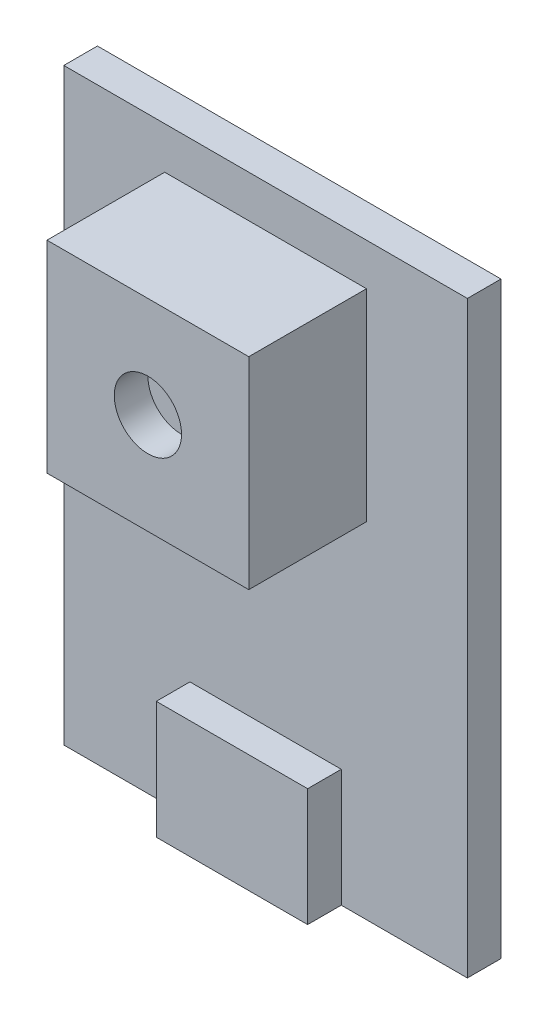
ISO-10303-21;
HEADER;
FILE_DESCRIPTION(('STEP AP214'),'2;1');
FILE_NAME('part.step','',(''),(''),'','','');
FILE_SCHEMA(('AUTOMOTIVE_DESIGN { 1 0 10303 214 1 1 1 1 }'));
ENDSEC;
DATA;
#1=APPLICATION_CONTEXT('core data for automotive mechanical design processes');
#2=APPLICATION_PROTOCOL_DEFINITION('international standard','automotive_design',2000,#1);
#3=PRODUCT_CONTEXT('',#1,'mechanical');
#4=PRODUCT('Part','Part','',(#3));
#5=PRODUCT_RELATED_PRODUCT_CATEGORY('part','',(#4));
#6=PRODUCT_DEFINITION_FORMATION('','',#4);
#7=PRODUCT_DEFINITION_CONTEXT('part definition',#1,'design');
#8=PRODUCT_DEFINITION('design','',#6,#7);
#9=PRODUCT_DEFINITION_SHAPE('','',#8);
#10=(LENGTH_UNIT() NAMED_UNIT(*) SI_UNIT(.MILLI.,.METRE.));
#11=(NAMED_UNIT(*) PLANE_ANGLE_UNIT() SI_UNIT($,.RADIAN.));
#12=(NAMED_UNIT(*) SI_UNIT($,.STERADIAN.) SOLID_ANGLE_UNIT());
#13=UNCERTAINTY_MEASURE_WITH_UNIT(LENGTH_MEASURE(1.E-05),#10,'distance_accuracy_value','');
#14=(GEOMETRIC_REPRESENTATION_CONTEXT(3) GLOBAL_UNCERTAINTY_ASSIGNED_CONTEXT((#13)) GLOBAL_UNIT_ASSIGNED_CONTEXT((#10,
#11,#12)) REPRESENTATION_CONTEXT('',''));
#15=CARTESIAN_POINT('',(0.,0.,0.));
#16=DIRECTION('',(0.,0.,1.));
#17=DIRECTION('',(1.,0.,0.));
#18=AXIS2_PLACEMENT_3D('',#15,#16,#17);
#19=CARTESIAN_POINT('',(0.,0.,0.));
#20=DIRECTION('',(0.,0.,1.));
#21=DIRECTION('',(1.,0.,0.));
#22=AXIS2_PLACEMENT_3D('',#19,#20,#21);
#23=PLANE('',#22);
#24=DIRECTION('',(0.,1.,0.));
#25=VECTOR('',#24,1.);
#26=CARTESIAN_POINT('',(6.,6.,0.));
#27=LINE('',#26,#25);
#28=CARTESIAN_POINT('',(6.,-6.,0.));
#29=VERTEX_POINT('',#28);
#30=CARTESIAN_POINT('',(6.,6.,0.));
#31=VERTEX_POINT('',#30);
#32=EDGE_CURVE('E81',#29,#31,#27,.T.);
#33=ORIENTED_EDGE('',*,*,#32,.F.);
#34=DIRECTION('',(1.,0.,0.));
#35=VECTOR('',#34,1.);
#36=CARTESIAN_POINT('',(-6.,-6.,0.));
#37=LINE('',#36,#35);
#38=CARTESIAN_POINT('',(-6.,-6.,0.));
#39=VERTEX_POINT('',#38);
#40=EDGE_CURVE('E114',#39,#29,#37,.T.);
#41=ORIENTED_EDGE('',*,*,#40,.F.);
#42=DIRECTION('',(0.,-1.,0.));
#43=VECTOR('',#42,1.);
#44=CARTESIAN_POINT('',(-6.,6.,0.));
#45=LINE('',#44,#43);
#46=CARTESIAN_POINT('',(-6.,6.,0.));
#47=VERTEX_POINT('',#46);
#48=EDGE_CURVE('E73',#47,#39,#45,.T.);
#49=ORIENTED_EDGE('',*,*,#48,.F.);
#50=DIRECTION('',(-1.,0.,0.));
#51=VECTOR('',#50,1.);
#52=CARTESIAN_POINT('',(-6.,6.,0.));
#53=LINE('',#52,#51);
#54=EDGE_CURVE('E100',#31,#47,#53,.T.);
#55=ORIENTED_EDGE('',*,*,#54,.F.);
#56=EDGE_LOOP('',(#33,#41,#49,#55));
#57=FACE_BOUND('',#56,.T.);
#58=DIRECTION('',(-1.,0.,0.));
#59=VECTOR('',#58,1.);
#60=CARTESIAN_POINT('',(12.,-26.5,0.));
#61=LINE('',#60,#59);
#62=CARTESIAN_POINT('',(-4.5,-26.5,0.));
#63=VERTEX_POINT('',#62);
#64=CARTESIAN_POINT('',(-12.,-26.5,0.));
#65=VERTEX_POINT('',#64);
#66=EDGE_CURVE('E138',#63,#65,#61,.T.);
#67=ORIENTED_EDGE('',*,*,#66,.F.);
#68=DIRECTION('',(0.,-1.,0.));
#69=VECTOR('',#68,1.);
#70=CARTESIAN_POINT('',(-4.5,-26.5,0.));
#71=LINE('',#70,#69);
#72=CARTESIAN_POINT('',(-4.5,-19.5,0.));
#73=VERTEX_POINT('',#72);
#74=EDGE_CURVE('E51',#73,#63,#71,.T.);
#75=ORIENTED_EDGE('',*,*,#74,.F.);
#76=DIRECTION('',(-1.,0.,0.));
#77=VECTOR('',#76,1.);
#78=CARTESIAN_POINT('',(-4.5,-19.5,0.));
#79=LINE('',#78,#77);
#80=CARTESIAN_POINT('',(4.5,-19.5,0.));
#81=VERTEX_POINT('',#80);
#82=EDGE_CURVE('E169',#81,#73,#79,.T.);
#83=ORIENTED_EDGE('',*,*,#82,.F.);
#84=DIRECTION('',(0.,1.,0.));
#85=VECTOR('',#84,1.);
#86=CARTESIAN_POINT('',(4.5,-26.5,0.));
#87=LINE('',#86,#85);
#88=CARTESIAN_POINT('',(4.5,-26.5,0.));
#89=VERTEX_POINT('',#88);
#90=EDGE_CURVE('E173',#89,#81,#87,.T.);
#91=ORIENTED_EDGE('',*,*,#90,.F.);
#92=CARTESIAN_POINT('',(12.,-26.5,0.));
#93=VERTEX_POINT('',#92);
#94=EDGE_CURVE('E134',#93,#89,#61,.T.);
#95=ORIENTED_EDGE('',*,*,#94,.F.);
#96=DIRECTION('',(0.,-1.,0.));
#97=VECTOR('',#96,1.);
#98=CARTESIAN_POINT('',(12.,-26.5,0.));
#99=LINE('',#98,#97);
#100=CARTESIAN_POINT('',(12.,8.50000000000001,0.));
#101=VERTEX_POINT('',#100);
#102=EDGE_CURVE('E139',#101,#93,#99,.T.);
#103=ORIENTED_EDGE('',*,*,#102,.F.);
#104=DIRECTION('',(1.,0.,0.));
#105=VECTOR('',#104,1.);
#106=CARTESIAN_POINT('',(12.,8.50000000000001,0.));
#107=LINE('',#106,#105);
#108=CARTESIAN_POINT('',(-12.,8.50000000000001,0.));
#109=VERTEX_POINT('',#108);
#110=EDGE_CURVE('E142',#109,#101,#107,.T.);
#111=ORIENTED_EDGE('',*,*,#110,.F.);
#112=DIRECTION('',(0.,1.,0.));
#113=VECTOR('',#112,1.);
#114=CARTESIAN_POINT('',(-12.,-26.5,0.));
#115=LINE('',#114,#113);
#116=EDGE_CURVE('E145',#65,#109,#115,.T.);
#117=ORIENTED_EDGE('',*,*,#116,.F.);
#118=EDGE_LOOP('',(#67,#75,#83,#91,#95,#103,#111,#117));
#119=FACE_BOUND('',#118,.T.);
#120=ADVANCED_FACE('F36',(#57,#119),#23,.T.);
#121=CARTESIAN_POINT('',(6.,6.,7.));
#122=DIRECTION('',(-1.,0.,0.));
#123=DIRECTION('',(0.,-1.,0.));
#124=AXIS2_PLACEMENT_3D('',#121,#122,#123);
#125=PLANE('',#124);
#126=ORIENTED_EDGE('',*,*,#32,.T.);
#127=DIRECTION('',(0.,0.,-1.));
#128=VECTOR('',#127,1.);
#129=CARTESIAN_POINT('',(6.,6.,7.));
#130=LINE('',#129,#128);
#131=CARTESIAN_POINT('',(6.,6.,7.));
#132=VERTEX_POINT('',#131);
#133=EDGE_CURVE('E11',#132,#31,#130,.T.);
#134=ORIENTED_EDGE('',*,*,#133,.F.);
#135=DIRECTION('',(0.,1.,0.));
#136=VECTOR('',#135,1.);
#137=CARTESIAN_POINT('',(6.,6.,7.));
#138=LINE('',#137,#136);
#139=CARTESIAN_POINT('',(6.,-6.,7.));
#140=VERTEX_POINT('',#139);
#141=EDGE_CURVE('E94',#140,#132,#138,.T.);
#142=ORIENTED_EDGE('',*,*,#141,.F.);
#143=DIRECTION('',(0.,0.,-1.));
#144=VECTOR('',#143,1.);
#145=CARTESIAN_POINT('',(6.,-6.,7.));
#146=LINE('',#145,#144);
#147=EDGE_CURVE('E106',#140,#29,#146,.T.);
#148=ORIENTED_EDGE('',*,*,#147,.T.);
#149=EDGE_LOOP('',(#126,#134,#142,#148));
#150=FACE_BOUND('',#149,.T.);
#151=ADVANCED_FACE('F38',(#150),#125,.F.);
#152=CARTESIAN_POINT('',(-6.,6.,7.));
#153=DIRECTION('',(0.,-1.,0.));
#154=DIRECTION('',(0.,0.,-1.));
#155=AXIS2_PLACEMENT_3D('',#152,#153,#154);
#156=PLANE('',#155);
#157=ORIENTED_EDGE('',*,*,#54,.T.);
#158=DIRECTION('',(0.,0.,-1.));
#159=VECTOR('',#158,1.);
#160=CARTESIAN_POINT('',(-6.,6.,7.));
#161=LINE('',#160,#159);
#162=CARTESIAN_POINT('',(-6.,6.,7.));
#163=VERTEX_POINT('',#162);
#164=EDGE_CURVE('E44',#163,#47,#161,.T.);
#165=ORIENTED_EDGE('',*,*,#164,.F.);
#166=DIRECTION('',(-1.,0.,0.));
#167=VECTOR('',#166,1.);
#168=CARTESIAN_POINT('',(-6.,6.,7.));
#169=LINE('',#168,#167);
#170=EDGE_CURVE('E87',#132,#163,#169,.T.);
#171=ORIENTED_EDGE('',*,*,#170,.F.);
#172=ORIENTED_EDGE('',*,*,#133,.T.);
#173=EDGE_LOOP('',(#157,#165,#171,#172));
#174=FACE_BOUND('',#173,.T.);
#175=ADVANCED_FACE('F99',(#174),#156,.F.);
#176=CARTESIAN_POINT('',(-6.,6.,7.));
#177=DIRECTION('',(1.,0.,0.));
#178=DIRECTION('',(0.,0.,-1.));
#179=AXIS2_PLACEMENT_3D('',#176,#177,#178);
#180=PLANE('',#179);
#181=ORIENTED_EDGE('',*,*,#48,.T.);
#182=DIRECTION('',(0.,0.,-1.));
#183=VECTOR('',#182,1.);
#184=CARTESIAN_POINT('',(-6.,-6.,7.));
#185=LINE('',#184,#183);
#186=CARTESIAN_POINT('',(-6.,-6.,7.));
#187=VERTEX_POINT('',#186);
#188=EDGE_CURVE('E102',#187,#39,#185,.T.);
#189=ORIENTED_EDGE('',*,*,#188,.F.);
#190=DIRECTION('',(0.,-1.,0.));
#191=VECTOR('',#190,1.);
#192=CARTESIAN_POINT('',(-6.,6.,7.));
#193=LINE('',#192,#191);
#194=EDGE_CURVE('E91',#163,#187,#193,.T.);
#195=ORIENTED_EDGE('',*,*,#194,.F.);
#196=ORIENTED_EDGE('',*,*,#164,.T.);
#197=EDGE_LOOP('',(#181,#189,#195,#196));
#198=FACE_BOUND('',#197,.T.);
#199=ADVANCED_FACE('F103',(#198),#180,.F.);
#200=CARTESIAN_POINT('',(-6.,-6.,7.));
#201=DIRECTION('',(0.,1.,0.));
#202=DIRECTION('',(0.,0.,1.));
#203=AXIS2_PLACEMENT_3D('',#200,#201,#202);
#204=PLANE('',#203);
#205=ORIENTED_EDGE('',*,*,#40,.T.);
#206=ORIENTED_EDGE('',*,*,#147,.F.);
#207=DIRECTION('',(1.,0.,0.));
#208=VECTOR('',#207,1.);
#209=CARTESIAN_POINT('',(-6.,-6.,7.));
#210=LINE('',#209,#208);
#211=EDGE_CURVE('E60',#187,#140,#210,.T.);
#212=ORIENTED_EDGE('',*,*,#211,.F.);
#213=ORIENTED_EDGE('',*,*,#188,.T.);
#214=EDGE_LOOP('',(#205,#206,#212,#213));
#215=FACE_BOUND('',#214,.T.);
#216=ADVANCED_FACE('F119',(#215),#204,.F.);
#217=CARTESIAN_POINT('',(0.,0.,7.));
#218=DIRECTION('',(0.,0.,1.));
#219=DIRECTION('',(1.,0.,0.));
#220=AXIS2_PLACEMENT_3D('',#217,#218,#219);
#221=PLANE('',#220);
#222=CARTESIAN_POINT('',(0.,0.,7.));
#223=DIRECTION('',(0.,0.,1.));
#224=DIRECTION('',(1.,0.,0.));
#225=AXIS2_PLACEMENT_3D('',#222,#223,#224);
#226=CIRCLE('',#225,2.);
#227=CARTESIAN_POINT('',(2.,0.,7.));
#228=VERTEX_POINT('',#227);
#229=EDGE_CURVE('E188',#228,#228,#226,.T.);
#230=ORIENTED_EDGE('',*,*,#229,.F.);
#231=EDGE_LOOP('',(#230));
#232=FACE_BOUND('',#231,.T.);
#233=ORIENTED_EDGE('',*,*,#141,.T.);
#234=ORIENTED_EDGE('',*,*,#170,.T.);
#235=ORIENTED_EDGE('',*,*,#194,.T.);
#236=ORIENTED_EDGE('',*,*,#211,.T.);
#237=EDGE_LOOP('',(#233,#234,#235,#236));
#238=FACE_BOUND('',#237,.T.);
#239=ADVANCED_FACE('F89',(#232,#238),#221,.T.);
#240=CARTESIAN_POINT('',(-12.,-26.5,-2.));
#241=DIRECTION('',(1.,0.,0.));
#242=DIRECTION('',(0.,0.,-1.));
#243=AXIS2_PLACEMENT_3D('',#240,#241,#242);
#244=PLANE('',#243);
#245=ORIENTED_EDGE('',*,*,#116,.T.);
#246=DIRECTION('',(0.,0.,1.));
#247=VECTOR('',#246,1.);
#248=CARTESIAN_POINT('',(-12.,8.50000000000001,-2.));
#249=LINE('',#248,#247);
#250=CARTESIAN_POINT('',(-12.,8.50000000000001,-2.));
#251=VERTEX_POINT('',#250);
#252=EDGE_CURVE('E111',#251,#109,#249,.T.);
#253=ORIENTED_EDGE('',*,*,#252,.F.);
#254=DIRECTION('',(0.,1.,0.));
#255=VECTOR('',#254,1.);
#256=CARTESIAN_POINT('',(-12.,-26.5,-2.));
#257=LINE('',#256,#255);
#258=CARTESIAN_POINT('',(-12.,-26.5,-2.));
#259=VERTEX_POINT('',#258);
#260=EDGE_CURVE('E137',#259,#251,#257,.T.);
#261=ORIENTED_EDGE('',*,*,#260,.F.);
#262=DIRECTION('',(0.,0.,1.));
#263=VECTOR('',#262,1.);
#264=CARTESIAN_POINT('',(-12.,-26.5,-2.));
#265=LINE('',#264,#263);
#266=EDGE_CURVE('E130',#259,#65,#265,.T.);
#267=ORIENTED_EDGE('',*,*,#266,.T.);
#268=EDGE_LOOP('',(#245,#253,#261,#267));
#269=FACE_BOUND('',#268,.T.);
#270=ADVANCED_FACE('F204',(#269),#244,.F.);
#271=CARTESIAN_POINT('',(12.,8.50000000000001,-2.));
#272=DIRECTION('',(0.,-1.,0.));
#273=DIRECTION('',(1.,0.,0.));
#274=AXIS2_PLACEMENT_3D('',#271,#272,#273);
#275=PLANE('',#274);
#276=ORIENTED_EDGE('',*,*,#110,.T.);
#277=DIRECTION('',(0.,0.,1.));
#278=VECTOR('',#277,1.);
#279=CARTESIAN_POINT('',(12.,8.50000000000001,-2.));
#280=LINE('',#279,#278);
#281=CARTESIAN_POINT('',(12.,8.50000000000001,-2.));
#282=VERTEX_POINT('',#281);
#283=EDGE_CURVE('E124',#282,#101,#280,.T.);
#284=ORIENTED_EDGE('',*,*,#283,.F.);
#285=DIRECTION('',(1.,0.,0.));
#286=VECTOR('',#285,1.);
#287=CARTESIAN_POINT('',(12.,8.50000000000001,-2.));
#288=LINE('',#287,#286);
#289=EDGE_CURVE('E154',#251,#282,#288,.T.);
#290=ORIENTED_EDGE('',*,*,#289,.F.);
#291=ORIENTED_EDGE('',*,*,#252,.T.);
#292=EDGE_LOOP('',(#276,#284,#290,#291));
#293=FACE_BOUND('',#292,.T.);
#294=ADVANCED_FACE('F210',(#293),#275,.F.);
#295=CARTESIAN_POINT('',(12.,-26.5,-2.));
#296=DIRECTION('',(-1.,0.,0.));
#297=DIRECTION('',(0.,0.,1.));
#298=AXIS2_PLACEMENT_3D('',#295,#296,#297);
#299=PLANE('',#298);
#300=ORIENTED_EDGE('',*,*,#102,.T.);
#301=DIRECTION('',(0.,0.,1.));
#302=VECTOR('',#301,1.);
#303=CARTESIAN_POINT('',(12.,-26.5,-2.));
#304=LINE('',#303,#302);
#305=CARTESIAN_POINT('',(12.,-26.5,-2.));
#306=VERTEX_POINT('',#305);
#307=EDGE_CURVE('E127',#306,#93,#304,.T.);
#308=ORIENTED_EDGE('',*,*,#307,.F.);
#309=DIRECTION('',(0.,-1.,0.));
#310=VECTOR('',#309,1.);
#311=CARTESIAN_POINT('',(12.,-26.5,-2.));
#312=LINE('',#311,#310);
#313=EDGE_CURVE('E151',#282,#306,#312,.T.);
#314=ORIENTED_EDGE('',*,*,#313,.F.);
#315=ORIENTED_EDGE('',*,*,#283,.T.);
#316=EDGE_LOOP('',(#300,#308,#314,#315));
#317=FACE_BOUND('',#316,.T.);
#318=ADVANCED_FACE('F227',(#317),#299,.F.);
#319=CARTESIAN_POINT('',(12.,-26.5,-2.));
#320=DIRECTION('',(0.,1.,0.));
#321=DIRECTION('',(0.,0.,1.));
#322=AXIS2_PLACEMENT_3D('',#319,#320,#321);
#323=PLANE('',#322);
#324=ORIENTED_EDGE('',*,*,#94,.T.);
#325=DIRECTION('',(0.,0.,-1.));
#326=VECTOR('',#325,1.);
#327=CARTESIAN_POINT('',(4.5,-26.5,2.));
#328=LINE('',#327,#326);
#329=CARTESIAN_POINT('',(4.5,-26.5,2.));
#330=VERTEX_POINT('',#329);
#331=EDGE_CURVE('E160',#330,#89,#328,.T.);
#332=ORIENTED_EDGE('',*,*,#331,.F.);
#333=DIRECTION('',(1.,0.,0.));
#334=VECTOR('',#333,1.);
#335=CARTESIAN_POINT('',(-4.5,-26.5,2.));
#336=LINE('',#335,#334);
#337=CARTESIAN_POINT('',(-4.5,-26.5,2.));
#338=VERTEX_POINT('',#337);
#339=EDGE_CURVE('E183',#338,#330,#336,.T.);
#340=ORIENTED_EDGE('',*,*,#339,.F.);
#341=DIRECTION('',(0.,0.,-1.));
#342=VECTOR('',#341,1.);
#343=CARTESIAN_POINT('',(-4.5,-26.5,2.));
#344=LINE('',#343,#342);
#345=EDGE_CURVE('E148',#338,#63,#344,.T.);
#346=ORIENTED_EDGE('',*,*,#345,.T.);
#347=ORIENTED_EDGE('',*,*,#66,.T.);
#348=ORIENTED_EDGE('',*,*,#266,.F.);
#349=DIRECTION('',(-1.,0.,0.));
#350=VECTOR('',#349,1.);
#351=CARTESIAN_POINT('',(12.,-26.5,-2.));
#352=LINE('',#351,#350);
#353=EDGE_CURVE('E133',#306,#259,#352,.T.);
#354=ORIENTED_EDGE('',*,*,#353,.F.);
#355=ORIENTED_EDGE('',*,*,#307,.T.);
#356=EDGE_LOOP('',(#324,#332,#340,#346,#347,#348,#354,#355));
#357=FACE_BOUND('',#356,.T.);
#358=ADVANCED_FACE('F224',(#357),#323,.F.);
#359=CARTESIAN_POINT('',(0.,0.,-2.));
#360=DIRECTION('',(0.,0.,1.));
#361=DIRECTION('',(1.,0.,0.));
#362=AXIS2_PLACEMENT_3D('',#359,#360,#361);
#363=PLANE('',#362);
#364=ORIENTED_EDGE('',*,*,#260,.T.);
#365=ORIENTED_EDGE('',*,*,#289,.T.);
#366=ORIENTED_EDGE('',*,*,#313,.T.);
#367=ORIENTED_EDGE('',*,*,#353,.T.);
#368=EDGE_LOOP('',(#364,#365,#366,#367));
#369=FACE_BOUND('',#368,.T.);
#370=ADVANCED_FACE('F222',(#369),#363,.F.);
#371=CARTESIAN_POINT('',(-4.5,-26.5,2.));
#372=DIRECTION('',(1.,0.,0.));
#373=DIRECTION('',(0.,0.,-1.));
#374=AXIS2_PLACEMENT_3D('',#371,#372,#373);
#375=PLANE('',#374);
#376=ORIENTED_EDGE('',*,*,#74,.T.);
#377=ORIENTED_EDGE('',*,*,#345,.F.);
#378=DIRECTION('',(0.,-1.,0.));
#379=VECTOR('',#378,1.);
#380=CARTESIAN_POINT('',(-4.5,-26.5,2.));
#381=LINE('',#380,#379);
#382=CARTESIAN_POINT('',(-4.5,-19.5,2.));
#383=VERTEX_POINT('',#382);
#384=EDGE_CURVE('E172',#383,#338,#381,.T.);
#385=ORIENTED_EDGE('',*,*,#384,.F.);
#386=DIRECTION('',(0.,0.,-1.));
#387=VECTOR('',#386,1.);
#388=CARTESIAN_POINT('',(-4.5,-19.5,2.));
#389=LINE('',#388,#387);
#390=EDGE_CURVE('E166',#383,#73,#389,.T.);
#391=ORIENTED_EDGE('',*,*,#390,.T.);
#392=EDGE_LOOP('',(#376,#377,#385,#391));
#393=FACE_BOUND('',#392,.T.);
#394=ADVANCED_FACE('F285',(#393),#375,.F.);
#395=CARTESIAN_POINT('',(4.5,-26.5,2.));
#396=DIRECTION('',(-1.,0.,0.));
#397=DIRECTION('',(0.,-1.,0.));
#398=AXIS2_PLACEMENT_3D('',#395,#396,#397);
#399=PLANE('',#398);
#400=ORIENTED_EDGE('',*,*,#90,.T.);
#401=DIRECTION('',(0.,0.,-1.));
#402=VECTOR('',#401,1.);
#403=CARTESIAN_POINT('',(4.5,-19.5,2.));
#404=LINE('',#403,#402);
#405=CARTESIAN_POINT('',(4.5,-19.5,2.));
#406=VERTEX_POINT('',#405);
#407=EDGE_CURVE('E163',#406,#81,#404,.T.);
#408=ORIENTED_EDGE('',*,*,#407,.F.);
#409=DIRECTION('',(0.,1.,0.));
#410=VECTOR('',#409,1.);
#411=CARTESIAN_POINT('',(4.5,-26.5,2.));
#412=LINE('',#411,#410);
#413=EDGE_CURVE('E180',#330,#406,#412,.T.);
#414=ORIENTED_EDGE('',*,*,#413,.F.);
#415=ORIENTED_EDGE('',*,*,#331,.T.);
#416=EDGE_LOOP('',(#400,#408,#414,#415));
#417=FACE_BOUND('',#416,.T.);
#418=ADVANCED_FACE('F289',(#417),#399,.F.);
#419=CARTESIAN_POINT('',(-4.5,-19.5,2.));
#420=DIRECTION('',(0.,-1.,0.));
#421=DIRECTION('',(0.,0.,-1.));
#422=AXIS2_PLACEMENT_3D('',#419,#420,#421);
#423=PLANE('',#422);
#424=ORIENTED_EDGE('',*,*,#82,.T.);
#425=ORIENTED_EDGE('',*,*,#390,.F.);
#426=DIRECTION('',(-1.,0.,0.));
#427=VECTOR('',#426,1.);
#428=CARTESIAN_POINT('',(-4.5,-19.5,2.));
#429=LINE('',#428,#427);
#430=EDGE_CURVE('E168',#406,#383,#429,.T.);
#431=ORIENTED_EDGE('',*,*,#430,.F.);
#432=ORIENTED_EDGE('',*,*,#407,.T.);
#433=EDGE_LOOP('',(#424,#425,#431,#432));
#434=FACE_BOUND('',#433,.T.);
#435=ADVANCED_FACE('F293',(#434),#423,.F.);
#436=CARTESIAN_POINT('',(0.,0.,2.));
#437=DIRECTION('',(0.,0.,-1.));
#438=DIRECTION('',(-1.,0.,0.));
#439=AXIS2_PLACEMENT_3D('',#436,#437,#438);
#440=PLANE('',#439);
#441=ORIENTED_EDGE('',*,*,#384,.T.);
#442=ORIENTED_EDGE('',*,*,#339,.T.);
#443=ORIENTED_EDGE('',*,*,#413,.T.);
#444=ORIENTED_EDGE('',*,*,#430,.T.);
#445=EDGE_LOOP('',(#441,#442,#443,#444));
#446=FACE_BOUND('',#445,.T.);
#447=ADVANCED_FACE('F199',(#446),#440,.F.);
#448=CARTESIAN_POINT('',(0.,0.,5.));
#449=DIRECTION('',(0.,0.,1.));
#450=DIRECTION('',(1.,0.,0.));
#451=AXIS2_PLACEMENT_3D('',#448,#449,#450);
#452=CYLINDRICAL_SURFACE('',#451,2.);
#453=CARTESIAN_POINT('',(0.,0.,5.));
#454=DIRECTION('',(0.,0.,1.));
#455=DIRECTION('',(1.,0.,0.));
#456=AXIS2_PLACEMENT_3D('',#453,#454,#455);
#457=CIRCLE('',#456,2.);
#458=CARTESIAN_POINT('',(2.,0.,5.));
#459=VERTEX_POINT('',#458);
#460=EDGE_CURVE('E177',#459,#459,#457,.T.);
#461=ORIENTED_EDGE('',*,*,#460,.F.);
#462=EDGE_LOOP('',(#461));
#463=FACE_BOUND('',#462,.T.);
#464=ORIENTED_EDGE('',*,*,#229,.T.);
#465=EDGE_LOOP('',(#464));
#466=FACE_BOUND('',#465,.T.);
#467=ADVANCED_FACE('F196',(#463,#466),#452,.F.);
#468=CARTESIAN_POINT('',(0.,0.,5.));
#469=DIRECTION('',(0.,0.,1.));
#470=DIRECTION('',(1.,0.,0.));
#471=AXIS2_PLACEMENT_3D('',#468,#469,#470);
#472=PLANE('',#471);
#473=ORIENTED_EDGE('',*,*,#460,.T.);
#474=EDGE_LOOP('',(#473));
#475=FACE_BOUND('',#474,.T.);
#476=ADVANCED_FACE('F194',(#475),#472,.T.);
#477=CLOSED_SHELL('',(#120,#151,#175,#199,#216,#239,#270,#294,#318,#358,#370,#394,#418,#435,
#447,#467,#476));
#478=MANIFOLD_SOLID_BREP('B2',#477);
#479=ADVANCED_BREP_SHAPE_REPRESENTATION('',(#18,#478),#14);
#480=SHAPE_DEFINITION_REPRESENTATION(#9,#479);
ENDSEC;
END-ISO-10303-21;
